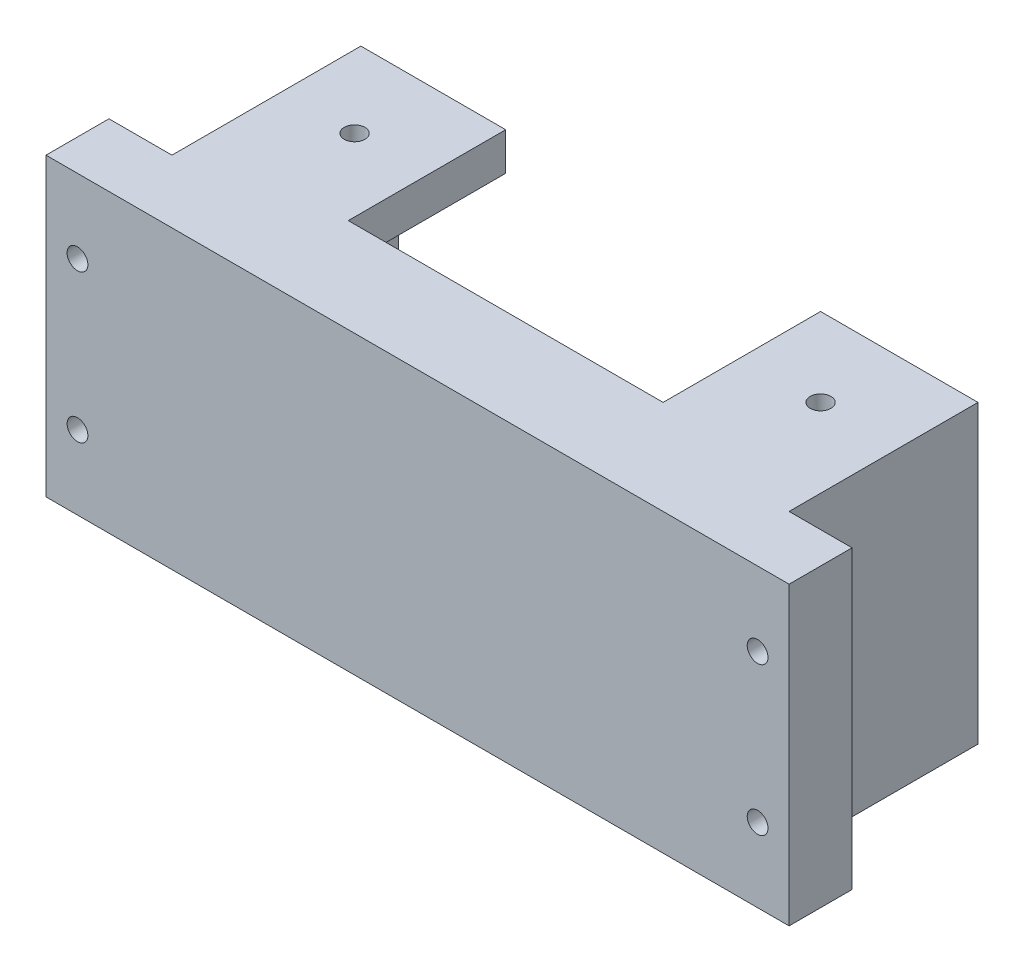
ISO-10303-21;
HEADER;
FILE_DESCRIPTION(('STEP AP214'),'2;1');
FILE_NAME('part.step','',(''),(''),'','','');
FILE_SCHEMA(('AUTOMOTIVE_DESIGN { 1 0 10303 214 1 1 1 1 }'));
ENDSEC;
DATA;
#1=APPLICATION_CONTEXT('core data for automotive mechanical design processes');
#2=APPLICATION_PROTOCOL_DEFINITION('international standard','automotive_design',2000,#1);
#3=PRODUCT_CONTEXT('',#1,'mechanical');
#4=PRODUCT('Part','Part','',(#3));
#5=PRODUCT_RELATED_PRODUCT_CATEGORY('part','',(#4));
#6=PRODUCT_DEFINITION_FORMATION('','',#4);
#7=PRODUCT_DEFINITION_CONTEXT('part definition',#1,'design');
#8=PRODUCT_DEFINITION('design','',#6,#7);
#9=PRODUCT_DEFINITION_SHAPE('','',#8);
#10=(LENGTH_UNIT() NAMED_UNIT(*) SI_UNIT(.MILLI.,.METRE.));
#11=(NAMED_UNIT(*) PLANE_ANGLE_UNIT() SI_UNIT($,.RADIAN.));
#12=(NAMED_UNIT(*) SI_UNIT($,.STERADIAN.) SOLID_ANGLE_UNIT());
#13=UNCERTAINTY_MEASURE_WITH_UNIT(LENGTH_MEASURE(1.E-05),#10,'distance_accuracy_value','');
#14=(GEOMETRIC_REPRESENTATION_CONTEXT(3) GLOBAL_UNCERTAINTY_ASSIGNED_CONTEXT((#13)) GLOBAL_UNIT_ASSIGNED_CONTEXT((#10,
#11,#12)) REPRESENTATION_CONTEXT('',''));
#15=CARTESIAN_POINT('',(0.,0.,0.));
#16=DIRECTION('',(0.,0.,1.));
#17=DIRECTION('',(1.,0.,0.));
#18=AXIS2_PLACEMENT_3D('',#15,#16,#17);
#19=CARTESIAN_POINT('',(0.,61.,0.));
#20=DIRECTION('',(0.,-1.,0.));
#21=DIRECTION('',(0.,0.,-1.));
#22=AXIS2_PLACEMENT_3D('',#19,#20,#21);
#23=PLANE('',#22);
#24=CARTESIAN_POINT('',(5.5,61.,-72.5));
#25=DIRECTION('',(0.,1.,0.));
#26=DIRECTION('',(0.,0.,1.));
#27=AXIS2_PLACEMENT_3D('',#24,#25,#26);
#28=CIRCLE('',#27,1.64999999999999);
#29=CARTESIAN_POINT('',(5.5,61.,-70.85));
#30=VERTEX_POINT('',#29);
#31=EDGE_CURVE('E822',#30,#30,#28,.T.);
#32=ORIENTED_EDGE('',*,*,#31,.F.);
#33=EDGE_LOOP('',(#32));
#34=FACE_BOUND('',#33,.T.);
#35=DIRECTION('',(0.,0.,1.));
#36=VECTOR('',#35,1.);
#37=CARTESIAN_POINT('',(-6.,61.,-4.));
#38=LINE('',#37,#36);
#39=CARTESIAN_POINT('',(-6.,61.,-85.));
#40=VERTEX_POINT('',#39);
#41=CARTESIAN_POINT('',(-6.,61.,-55.));
#42=VERTEX_POINT('',#41);
#43=EDGE_CURVE('E323',#40,#42,#38,.T.);
#44=ORIENTED_EDGE('',*,*,#43,.T.);
#45=DIRECTION('',(1.,0.,0.));
#46=VECTOR('',#45,1.);
#47=CARTESIAN_POINT('',(0.,61.,-55.));
#48=LINE('',#47,#46);
#49=CARTESIAN_POINT('',(-16.,61.,-55.));
#50=VERTEX_POINT('',#49);
#51=EDGE_CURVE('E60',#50,#42,#48,.T.);
#52=ORIENTED_EDGE('',*,*,#51,.F.);
#53=DIRECTION('',(0.,0.,-1.));
#54=VECTOR('',#53,1.);
#55=CARTESIAN_POINT('',(-16.,61.,0.));
#56=LINE('',#55,#54);
#57=CARTESIAN_POINT('',(-16.,61.,-45.));
#58=VERTEX_POINT('',#57);
#59=EDGE_CURVE('E288',#58,#50,#56,.T.);
#60=ORIENTED_EDGE('',*,*,#59,.F.);
#61=DIRECTION('',(1.,0.,0.));
#62=VECTOR('',#61,1.);
#63=CARTESIAN_POINT('',(0.,61.,-45.));
#64=LINE('',#63,#62);
#65=CARTESIAN_POINT('',(102.,61.,-45.));
#66=VERTEX_POINT('',#65);
#67=EDGE_CURVE('E11',#58,#66,#64,.T.);
#68=ORIENTED_EDGE('',*,*,#67,.T.);
#69=DIRECTION('',(0.,0.,-1.));
#70=VECTOR('',#69,1.);
#71=CARTESIAN_POINT('',(102.,61.,0.));
#72=LINE('',#71,#70);
#73=CARTESIAN_POINT('',(102.,61.,-55.));
#74=VERTEX_POINT('',#73);
#75=EDGE_CURVE('E270',#66,#74,#72,.T.);
#76=ORIENTED_EDGE('',*,*,#75,.T.);
#77=DIRECTION('',(-1.,0.,0.));
#78=VECTOR('',#77,1.);
#79=CARTESIAN_POINT('',(0.,61.,-55.));
#80=LINE('',#79,#78);
#81=CARTESIAN_POINT('',(92.,61.,-55.));
#82=VERTEX_POINT('',#81);
#83=EDGE_CURVE('E184',#74,#82,#80,.T.);
#84=ORIENTED_EDGE('',*,*,#83,.T.);
#85=DIRECTION('',(0.,0.,-1.));
#86=VECTOR('',#85,1.);
#87=CARTESIAN_POINT('',(92.,61.,-75.));
#88=LINE('',#87,#86);
#89=CARTESIAN_POINT('',(92.,61.,-85.));
#90=VERTEX_POINT('',#89);
#91=EDGE_CURVE('E175',#82,#90,#88,.T.);
#92=ORIENTED_EDGE('',*,*,#91,.T.);
#93=DIRECTION('',(1.,0.,0.));
#94=VECTOR('',#93,1.);
#95=CARTESIAN_POINT('',(92.,61.,-85.));
#96=LINE('',#95,#94);
#97=CARTESIAN_POINT('',(67.,61.,-85.));
#98=VERTEX_POINT('',#97);
#99=EDGE_CURVE('E181',#98,#90,#96,.T.);
#100=ORIENTED_EDGE('',*,*,#99,.F.);
#101=DIRECTION('',(0.,0.,1.));
#102=VECTOR('',#101,1.);
#103=CARTESIAN_POINT('',(67.,61.,-50.));
#104=LINE('',#103,#102);
#105=CARTESIAN_POINT('',(67.,61.,-60.));
#106=VERTEX_POINT('',#105);
#107=EDGE_CURVE('E185',#98,#106,#104,.T.);
#108=ORIENTED_EDGE('',*,*,#107,.T.);
#109=DIRECTION('',(-1.,0.,0.));
#110=VECTOR('',#109,1.);
#111=CARTESIAN_POINT('',(17.,61.,-60.));
#112=LINE('',#111,#110);
#113=CARTESIAN_POINT('',(17.,61.,-60.));
#114=VERTEX_POINT('',#113);
#115=EDGE_CURVE('E301',#106,#114,#112,.T.);
#116=ORIENTED_EDGE('',*,*,#115,.T.);
#117=DIRECTION('',(0.,0.,-1.));
#118=VECTOR('',#117,1.);
#119=CARTESIAN_POINT('',(17.,61.,-75.));
#120=LINE('',#119,#118);
#121=CARTESIAN_POINT('',(17.,61.,-85.));
#122=VERTEX_POINT('',#121);
#123=EDGE_CURVE('E321',#114,#122,#120,.T.);
#124=ORIENTED_EDGE('',*,*,#123,.T.);
#125=DIRECTION('',(1.,0.,0.));
#126=VECTOR('',#125,1.);
#127=CARTESIAN_POINT('',(17.,61.,-85.));
#128=LINE('',#127,#126);
#129=EDGE_CURVE('E228',#40,#122,#128,.T.);
#130=ORIENTED_EDGE('',*,*,#129,.F.);
#131=EDGE_LOOP('',(#44,#52,#60,#68,#76,#84,#92,#100,#108,#116,#124,#130));
#132=FACE_BOUND('',#131,.T.);
#133=CARTESIAN_POINT('',(79.5,61.,-72.5));
#134=DIRECTION('',(0.,1.,0.));
#135=DIRECTION('',(0.,0.,1.));
#136=AXIS2_PLACEMENT_3D('',#133,#134,#135);
#137=CIRCLE('',#136,1.64999999999998);
#138=CARTESIAN_POINT('',(79.5,61.,-70.85));
#139=VERTEX_POINT('',#138);
#140=EDGE_CURVE('E814',#139,#139,#137,.T.);
#141=ORIENTED_EDGE('',*,*,#140,.F.);
#142=EDGE_LOOP('',(#141));
#143=FACE_BOUND('',#142,.T.);
#144=ADVANCED_FACE('F37',(#34,#132,#143),#23,.F.);
#145=CARTESIAN_POINT('',(0.,14.,0.));
#146=DIRECTION('',(0.,-1.,0.));
#147=DIRECTION('',(0.,0.,-1.));
#148=AXIS2_PLACEMENT_3D('',#145,#146,#147);
#149=PLANE('',#148);
#150=CARTESIAN_POINT('',(79.5,14.,-72.5));
#151=DIRECTION('',(0.,1.,0.));
#152=DIRECTION('',(0.,0.,1.));
#153=AXIS2_PLACEMENT_3D('',#150,#151,#152);
#154=CIRCLE('',#153,1.65);
#155=CARTESIAN_POINT('',(79.5,14.,-70.85));
#156=VERTEX_POINT('',#155);
#157=EDGE_CURVE('E812',#156,#156,#154,.T.);
#158=ORIENTED_EDGE('',*,*,#157,.T.);
#159=EDGE_LOOP('',(#158));
#160=FACE_BOUND('',#159,.T.);
#161=DIRECTION('',(1.,0.,0.));
#162=VECTOR('',#161,1.);
#163=CARTESIAN_POINT('',(-26.,14.,-45.));
#164=LINE('',#163,#162);
#165=CARTESIAN_POINT('',(-16.,14.,-45.));
#166=VERTEX_POINT('',#165);
#167=CARTESIAN_POINT('',(102.,14.,-45.));
#168=VERTEX_POINT('',#167);
#169=EDGE_CURVE('E295',#166,#168,#164,.T.);
#170=ORIENTED_EDGE('',*,*,#169,.F.);
#171=DIRECTION('',(0.,0.,-1.));
#172=VECTOR('',#171,1.);
#173=CARTESIAN_POINT('',(-16.,14.,0.));
#174=LINE('',#173,#172);
#175=CARTESIAN_POINT('',(-16.,14.,-55.));
#176=VERTEX_POINT('',#175);
#177=EDGE_CURVE('E287',#166,#176,#174,.T.);
#178=ORIENTED_EDGE('',*,*,#177,.T.);
#179=DIRECTION('',(1.,0.,0.));
#180=VECTOR('',#179,1.);
#181=CARTESIAN_POINT('',(0.,14.,-55.));
#182=LINE('',#181,#180);
#183=CARTESIAN_POINT('',(-6.,14.,-55.));
#184=VERTEX_POINT('',#183);
#185=EDGE_CURVE('E285',#176,#184,#182,.T.);
#186=ORIENTED_EDGE('',*,*,#185,.T.);
#187=DIRECTION('',(0.,0.,-1.));
#188=VECTOR('',#187,1.);
#189=CARTESIAN_POINT('',(-6.,14.,-4.));
#190=LINE('',#189,#188);
#191=CARTESIAN_POINT('',(-6.,14.,-85.));
#192=VERTEX_POINT('',#191);
#193=EDGE_CURVE('E325',#184,#192,#190,.T.);
#194=ORIENTED_EDGE('',*,*,#193,.T.);
#195=DIRECTION('',(-1.,0.,0.));
#196=VECTOR('',#195,1.);
#197=CARTESIAN_POINT('',(-6.,14.,-85.));
#198=LINE('',#197,#196);
#199=CARTESIAN_POINT('',(17.,14.,-85.));
#200=VERTEX_POINT('',#199);
#201=EDGE_CURVE('E222',#200,#192,#198,.T.);
#202=ORIENTED_EDGE('',*,*,#201,.F.);
#203=DIRECTION('',(0.,0.,1.));
#204=VECTOR('',#203,1.);
#205=CARTESIAN_POINT('',(17.,14.,-75.));
#206=LINE('',#205,#204);
#207=CARTESIAN_POINT('',(17.,14.,-60.));
#208=VERTEX_POINT('',#207);
#209=EDGE_CURVE('E327',#200,#208,#206,.T.);
#210=ORIENTED_EDGE('',*,*,#209,.T.);
#211=DIRECTION('',(-1.,0.,0.));
#212=VECTOR('',#211,1.);
#213=CARTESIAN_POINT('',(0.,14.,-60.));
#214=LINE('',#213,#212);
#215=CARTESIAN_POINT('',(67.,14.,-60.));
#216=VERTEX_POINT('',#215);
#217=EDGE_CURVE('E309',#216,#208,#214,.T.);
#218=ORIENTED_EDGE('',*,*,#217,.F.);
#219=DIRECTION('',(0.,0.,-1.));
#220=VECTOR('',#219,1.);
#221=CARTESIAN_POINT('',(67.,14.,-50.));
#222=LINE('',#221,#220);
#223=CARTESIAN_POINT('',(67.,14.,-85.));
#224=VERTEX_POINT('',#223);
#225=EDGE_CURVE('E330',#216,#224,#222,.T.);
#226=ORIENTED_EDGE('',*,*,#225,.T.);
#227=DIRECTION('',(-1.,0.,0.));
#228=VECTOR('',#227,1.);
#229=CARTESIAN_POINT('',(67.,14.,-85.));
#230=LINE('',#229,#228);
#231=CARTESIAN_POINT('',(92.,14.,-85.));
#232=VERTEX_POINT('',#231);
#233=EDGE_CURVE('E195',#232,#224,#230,.T.);
#234=ORIENTED_EDGE('',*,*,#233,.F.);
#235=DIRECTION('',(0.,0.,1.));
#236=VECTOR('',#235,1.);
#237=CARTESIAN_POINT('',(92.,14.,-75.));
#238=LINE('',#237,#236);
#239=CARTESIAN_POINT('',(92.,14.,-55.));
#240=VERTEX_POINT('',#239);
#241=EDGE_CURVE('E191',#232,#240,#238,.T.);
#242=ORIENTED_EDGE('',*,*,#241,.T.);
#243=DIRECTION('',(-1.,0.,0.));
#244=VECTOR('',#243,1.);
#245=CARTESIAN_POINT('',(0.,14.,-55.));
#246=LINE('',#245,#244);
#247=CARTESIAN_POINT('',(102.,14.,-55.));
#248=VERTEX_POINT('',#247);
#249=EDGE_CURVE('E274',#248,#240,#246,.T.);
#250=ORIENTED_EDGE('',*,*,#249,.F.);
#251=DIRECTION('',(0.,0.,-1.));
#252=VECTOR('',#251,1.);
#253=CARTESIAN_POINT('',(102.,14.,0.));
#254=LINE('',#253,#252);
#255=EDGE_CURVE('E271',#168,#248,#254,.T.);
#256=ORIENTED_EDGE('',*,*,#255,.F.);
#257=EDGE_LOOP('',(#170,#178,#186,#194,#202,#210,#218,#226,#234,#242,#250,#256));
#258=FACE_BOUND('',#257,.T.);
#259=CARTESIAN_POINT('',(5.5,14.,-72.5));
#260=DIRECTION('',(0.,1.,0.));
#261=DIRECTION('',(0.,0.,1.));
#262=AXIS2_PLACEMENT_3D('',#259,#260,#261);
#263=CIRCLE('',#262,1.64999999999999);
#264=CARTESIAN_POINT('',(5.5,14.,-70.85));
#265=VERTEX_POINT('',#264);
#266=EDGE_CURVE('E825',#265,#265,#263,.T.);
#267=ORIENTED_EDGE('',*,*,#266,.T.);
#268=EDGE_LOOP('',(#267));
#269=FACE_BOUND('',#268,.T.);
#270=ADVANCED_FACE('F372',(#160,#258,#269),#149,.T.);
#271=CARTESIAN_POINT('',(92.,75.,0.));
#272=DIRECTION('',(-1.,0.,0.));
#273=DIRECTION('',(0.,0.,1.));
#274=AXIS2_PLACEMENT_3D('',#271,#272,#273);
#275=PLANE('',#274);
#276=DIRECTION('',(0.,1.,0.));
#277=VECTOR('',#276,1.);
#278=CARTESIAN_POINT('',(92.,14.,-55.));
#279=LINE('',#278,#277);
#280=EDGE_CURVE('E52',#240,#82,#279,.T.);
#281=ORIENTED_EDGE('',*,*,#280,.F.);
#282=ORIENTED_EDGE('',*,*,#241,.F.);
#283=DIRECTION('',(0.,-1.,0.));
#284=VECTOR('',#283,1.);
#285=CARTESIAN_POINT('',(92.,14.,-85.));
#286=LINE('',#285,#284);
#287=EDGE_CURVE('E189',#90,#232,#286,.T.);
#288=ORIENTED_EDGE('',*,*,#287,.F.);
#289=ORIENTED_EDGE('',*,*,#91,.F.);
#290=EDGE_LOOP('',(#281,#282,#288,#289));
#291=FACE_BOUND('',#290,.T.);
#292=ADVANCED_FACE('F190',(#291),#275,.F.);
#293=CARTESIAN_POINT('',(67.,75.,0.));
#294=DIRECTION('',(1.,0.,0.));
#295=DIRECTION('',(0.,0.,-1.));
#296=AXIS2_PLACEMENT_3D('',#293,#294,#295);
#297=PLANE('',#296);
#298=DIRECTION('',(0.,-1.,0.));
#299=VECTOR('',#298,1.);
#300=CARTESIAN_POINT('',(67.,20.,-60.));
#301=LINE('',#300,#299);
#302=CARTESIAN_POINT('',(67.,20.,-60.));
#303=VERTEX_POINT('',#302);
#304=EDGE_CURVE('E314',#303,#216,#301,.T.);
#305=ORIENTED_EDGE('',*,*,#304,.F.);
#306=DIRECTION('',(0.,0.,1.));
#307=VECTOR('',#306,1.);
#308=CARTESIAN_POINT('',(67.,20.,0.));
#309=LINE('',#308,#307);
#310=CARTESIAN_POINT('',(67.,20.,-85.));
#311=VERTEX_POINT('',#310);
#312=EDGE_CURVE('E354',#311,#303,#309,.T.);
#313=ORIENTED_EDGE('',*,*,#312,.F.);
#314=DIRECTION('',(0.,1.,0.));
#315=VECTOR('',#314,1.);
#316=CARTESIAN_POINT('',(67.,20.,-85.));
#317=LINE('',#316,#315);
#318=EDGE_CURVE('E210',#224,#311,#317,.T.);
#319=ORIENTED_EDGE('',*,*,#318,.F.);
#320=ORIENTED_EDGE('',*,*,#225,.F.);
#321=EDGE_LOOP('',(#305,#313,#319,#320));
#322=FACE_BOUND('',#321,.T.);
#323=ADVANCED_FACE('F442',(#322),#297,.F.);
#324=CARTESIAN_POINT('',(17.,75.,0.));
#325=DIRECTION('',(-1.,0.,0.));
#326=DIRECTION('',(0.,0.,1.));
#327=AXIS2_PLACEMENT_3D('',#324,#325,#326);
#328=PLANE('',#327);
#329=DIRECTION('',(0.,-1.,0.));
#330=VECTOR('',#329,1.);
#331=CARTESIAN_POINT('',(17.,20.,-60.));
#332=LINE('',#331,#330);
#333=CARTESIAN_POINT('',(17.,20.,-60.));
#334=VERTEX_POINT('',#333);
#335=EDGE_CURVE('E186',#334,#208,#332,.T.);
#336=ORIENTED_EDGE('',*,*,#335,.T.);
#337=ORIENTED_EDGE('',*,*,#209,.F.);
#338=DIRECTION('',(0.,-1.,0.));
#339=VECTOR('',#338,1.);
#340=CARTESIAN_POINT('',(17.,14.,-85.));
#341=LINE('',#340,#339);
#342=CARTESIAN_POINT('',(17.,20.,-85.));
#343=VERTEX_POINT('',#342);
#344=EDGE_CURVE('E243',#343,#200,#341,.T.);
#345=ORIENTED_EDGE('',*,*,#344,.F.);
#346=DIRECTION('',(0.,0.,-1.));
#347=VECTOR('',#346,1.);
#348=CARTESIAN_POINT('',(17.,20.,0.));
#349=LINE('',#348,#347);
#350=EDGE_CURVE('E45',#334,#343,#349,.T.);
#351=ORIENTED_EDGE('',*,*,#350,.F.);
#352=EDGE_LOOP('',(#336,#337,#345,#351));
#353=FACE_BOUND('',#352,.T.);
#354=ADVANCED_FACE('F370',(#353),#328,.F.);
#355=CARTESIAN_POINT('',(0.,75.,-50.));
#356=DIRECTION('',(0.,0.,1.));
#357=DIRECTION('',(1.,0.,0.));
#358=AXIS2_PLACEMENT_3D('',#355,#356,#357);
#359=PLANE('',#358);
#360=DIRECTION('',(0.,1.,0.));
#361=VECTOR('',#360,1.);
#362=CARTESIAN_POINT('',(0.,0.,-50.));
#363=LINE('',#362,#361);
#364=CARTESIAN_POINT('',(0.,20.,-50.));
#365=VERTEX_POINT('',#364);
#366=CARTESIAN_POINT('',(0.,55.,-50.));
#367=VERTEX_POINT('',#366);
#368=EDGE_CURVE('E335',#365,#367,#363,.T.);
#369=ORIENTED_EDGE('',*,*,#368,.T.);
#370=DIRECTION('',(1.,0.,0.));
#371=VECTOR('',#370,1.);
#372=CARTESIAN_POINT('',(0.,55.,-50.));
#373=LINE('',#372,#371);
#374=CARTESIAN_POINT('',(86.,55.,-50.));
#375=VERTEX_POINT('',#374);
#376=EDGE_CURVE('E338',#367,#375,#373,.T.);
#377=ORIENTED_EDGE('',*,*,#376,.T.);
#378=DIRECTION('',(0.,1.,0.));
#379=VECTOR('',#378,1.);
#380=CARTESIAN_POINT('',(86.,0.,-50.));
#381=LINE('',#380,#379);
#382=CARTESIAN_POINT('',(86.,20.,-50.));
#383=VERTEX_POINT('',#382);
#384=EDGE_CURVE('E340',#383,#375,#381,.T.);
#385=ORIENTED_EDGE('',*,*,#384,.F.);
#386=DIRECTION('',(1.,0.,0.));
#387=VECTOR('',#386,1.);
#388=CARTESIAN_POINT('',(0.,20.,-50.));
#389=LINE('',#388,#387);
#390=EDGE_CURVE('E333',#365,#383,#389,.T.);
#391=ORIENTED_EDGE('',*,*,#390,.F.);
#392=EDGE_LOOP('',(#369,#377,#385,#391));
#393=FACE_BOUND('',#392,.T.);
#394=ADVANCED_FACE('F394',(#393),#359,.F.);
#395=CARTESIAN_POINT('',(-6.,75.,0.));
#396=DIRECTION('',(1.,0.,0.));
#397=DIRECTION('',(0.,0.,-1.));
#398=AXIS2_PLACEMENT_3D('',#395,#396,#397);
#399=PLANE('',#398);
#400=ORIENTED_EDGE('',*,*,#193,.F.);
#401=DIRECTION('',(0.,1.,0.));
#402=VECTOR('',#401,1.);
#403=CARTESIAN_POINT('',(-6.,14.,-55.));
#404=LINE('',#403,#402);
#405=EDGE_CURVE('E293',#184,#42,#404,.T.);
#406=ORIENTED_EDGE('',*,*,#405,.T.);
#407=ORIENTED_EDGE('',*,*,#43,.F.);
#408=DIRECTION('',(0.,1.,0.));
#409=VECTOR('',#408,1.);
#410=CARTESIAN_POINT('',(-6.,61.,-85.));
#411=LINE('',#410,#409);
#412=EDGE_CURVE('E225',#192,#40,#411,.T.);
#413=ORIENTED_EDGE('',*,*,#412,.F.);
#414=EDGE_LOOP('',(#400,#406,#407,#413));
#415=FACE_BOUND('',#414,.T.);
#416=ADVANCED_FACE('F39',(#415),#399,.F.);
#417=DIRECTION('',(0.,0.,1.));
#418=VECTOR('',#417,1.);
#419=CARTESIAN_POINT('',(67.,55.,0.));
#420=LINE('',#419,#418);
#421=CARTESIAN_POINT('',(67.,55.,-85.));
#422=VERTEX_POINT('',#421);
#423=CARTESIAN_POINT('',(67.,55.,-60.));
#424=VERTEX_POINT('',#423);
#425=EDGE_CURVE('E346',#422,#424,#420,.T.);
#426=ORIENTED_EDGE('',*,*,#425,.T.);
#427=DIRECTION('',(0.,1.,0.));
#428=VECTOR('',#427,1.);
#429=CARTESIAN_POINT('',(67.,55.,-60.));
#430=LINE('',#429,#428);
#431=EDGE_CURVE('E304',#424,#106,#430,.T.);
#432=ORIENTED_EDGE('',*,*,#431,.T.);
#433=ORIENTED_EDGE('',*,*,#107,.F.);
#434=DIRECTION('',(0.,1.,0.));
#435=VECTOR('',#434,1.);
#436=CARTESIAN_POINT('',(67.,61.,-85.));
#437=LINE('',#436,#435);
#438=EDGE_CURVE('E201',#422,#98,#437,.T.);
#439=ORIENTED_EDGE('',*,*,#438,.F.);
#440=EDGE_LOOP('',(#426,#432,#433,#439));
#441=FACE_BOUND('',#440,.T.);
#442=ADVANCED_FACE('F404',(#441),#297,.F.);
#443=ORIENTED_EDGE('',*,*,#123,.F.);
#444=DIRECTION('',(0.,1.,0.));
#445=VECTOR('',#444,1.);
#446=CARTESIAN_POINT('',(17.,55.,-60.));
#447=LINE('',#446,#445);
#448=CARTESIAN_POINT('',(17.,55.,-60.));
#449=VERTEX_POINT('',#448);
#450=EDGE_CURVE('E307',#449,#114,#447,.T.);
#451=ORIENTED_EDGE('',*,*,#450,.F.);
#452=DIRECTION('',(0.,0.,-1.));
#453=VECTOR('',#452,1.);
#454=CARTESIAN_POINT('',(17.,55.,0.));
#455=LINE('',#454,#453);
#456=CARTESIAN_POINT('',(17.,55.,-85.));
#457=VERTEX_POINT('',#456);
#458=EDGE_CURVE('E357',#449,#457,#455,.T.);
#459=ORIENTED_EDGE('',*,*,#458,.T.);
#460=DIRECTION('',(0.,-1.,0.));
#461=VECTOR('',#460,1.);
#462=CARTESIAN_POINT('',(17.,55.,-85.));
#463=LINE('',#462,#461);
#464=EDGE_CURVE('E231',#122,#457,#463,.T.);
#465=ORIENTED_EDGE('',*,*,#464,.F.);
#466=EDGE_LOOP('',(#443,#451,#459,#465));
#467=FACE_BOUND('',#466,.T.);
#468=ADVANCED_FACE('F382',(#467),#328,.F.);
#469=CARTESIAN_POINT('',(0.,0.,-50.));
#470=DIRECTION('',(-1.,0.,0.));
#471=DIRECTION('',(0.,-1.,0.));
#472=AXIS2_PLACEMENT_3D('',#469,#470,#471);
#473=PLANE('',#472);
#474=DIRECTION('',(0.,0.,-1.));
#475=VECTOR('',#474,1.);
#476=CARTESIAN_POINT('',(0.,20.,-50.));
#477=LINE('',#476,#475);
#478=CARTESIAN_POINT('',(0.,20.,-85.));
#479=VERTEX_POINT('',#478);
#480=EDGE_CURVE('E343',#365,#479,#477,.T.);
#481=ORIENTED_EDGE('',*,*,#480,.T.);
#482=DIRECTION('',(0.,-1.,0.));
#483=VECTOR('',#482,1.);
#484=CARTESIAN_POINT('',(0.,20.,-85.));
#485=LINE('',#484,#483);
#486=CARTESIAN_POINT('',(0.,55.,-85.));
#487=VERTEX_POINT('',#486);
#488=EDGE_CURVE('E237',#487,#479,#485,.T.);
#489=ORIENTED_EDGE('',*,*,#488,.F.);
#490=DIRECTION('',(0.,0.,-1.));
#491=VECTOR('',#490,1.);
#492=CARTESIAN_POINT('',(0.,55.,-50.));
#493=LINE('',#492,#491);
#494=EDGE_CURVE('E349',#367,#487,#493,.T.);
#495=ORIENTED_EDGE('',*,*,#494,.F.);
#496=ORIENTED_EDGE('',*,*,#368,.F.);
#497=EDGE_LOOP('',(#481,#489,#495,#496));
#498=FACE_BOUND('',#497,.T.);
#499=ADVANCED_FACE('F392',(#498),#473,.F.);
#500=CARTESIAN_POINT('',(0.,20.,-50.));
#501=DIRECTION('',(0.,1.,0.));
#502=DIRECTION('',(0.,0.,1.));
#503=AXIS2_PLACEMENT_3D('',#500,#501,#502);
#504=PLANE('',#503);
#505=CARTESIAN_POINT('',(79.5,20.,-72.5));
#506=DIRECTION('',(0.,1.,0.));
#507=DIRECTION('',(0.,0.,1.));
#508=AXIS2_PLACEMENT_3D('',#505,#506,#507);
#509=CIRCLE('',#508,1.64999999999999);
#510=CARTESIAN_POINT('',(79.5,20.,-70.85));
#511=VERTEX_POINT('',#510);
#512=EDGE_CURVE('E809',#511,#511,#509,.T.);
#513=ORIENTED_EDGE('',*,*,#512,.F.);
#514=EDGE_LOOP('',(#513));
#515=FACE_BOUND('',#514,.T.);
#516=CARTESIAN_POINT('',(5.5,20.,-72.5));
#517=DIRECTION('',(0.,1.,0.));
#518=DIRECTION('',(0.,0.,1.));
#519=AXIS2_PLACEMENT_3D('',#516,#517,#518);
#520=CIRCLE('',#519,1.64999999999999);
#521=CARTESIAN_POINT('',(5.5,20.,-70.85));
#522=VERTEX_POINT('',#521);
#523=EDGE_CURVE('E205',#522,#522,#520,.T.);
#524=ORIENTED_EDGE('',*,*,#523,.F.);
#525=EDGE_LOOP('',(#524));
#526=FACE_BOUND('',#525,.T.);
#527=ORIENTED_EDGE('',*,*,#312,.T.);
#528=DIRECTION('',(-1.,0.,0.));
#529=VECTOR('',#528,1.);
#530=CARTESIAN_POINT('',(0.,20.,-60.));
#531=LINE('',#530,#529);
#532=EDGE_CURVE('E312',#303,#334,#531,.T.);
#533=ORIENTED_EDGE('',*,*,#532,.T.);
#534=ORIENTED_EDGE('',*,*,#350,.T.);
#535=DIRECTION('',(1.,0.,0.));
#536=VECTOR('',#535,1.);
#537=CARTESIAN_POINT('',(17.,20.,-85.));
#538=LINE('',#537,#536);
#539=EDGE_CURVE('E240',#479,#343,#538,.T.);
#540=ORIENTED_EDGE('',*,*,#539,.F.);
#541=ORIENTED_EDGE('',*,*,#480,.F.);
#542=ORIENTED_EDGE('',*,*,#390,.T.);
#543=DIRECTION('',(0.,0.,-1.));
#544=VECTOR('',#543,1.);
#545=CARTESIAN_POINT('',(86.,20.,-50.));
#546=LINE('',#545,#544);
#547=CARTESIAN_POINT('',(86.,20.,-85.));
#548=VERTEX_POINT('',#547);
#549=EDGE_CURVE('E344',#383,#548,#546,.T.);
#550=ORIENTED_EDGE('',*,*,#549,.T.);
#551=DIRECTION('',(1.,0.,0.));
#552=VECTOR('',#551,1.);
#553=CARTESIAN_POINT('',(86.,20.,-85.));
#554=LINE('',#553,#552);
#555=EDGE_CURVE('E213',#311,#548,#554,.T.);
#556=ORIENTED_EDGE('',*,*,#555,.F.);
#557=EDGE_LOOP('',(#527,#533,#534,#540,#541,#542,#550,#556));
#558=FACE_BOUND('',#557,.T.);
#559=ADVANCED_FACE('F361',(#515,#526,#558),#504,.T.);
#560=CARTESIAN_POINT('',(0.,55.,-50.));
#561=DIRECTION('',(0.,1.,0.));
#562=DIRECTION('',(0.,0.,1.));
#563=AXIS2_PLACEMENT_3D('',#560,#561,#562);
#564=PLANE('',#563);
#565=CARTESIAN_POINT('',(79.5,55.,-72.5));
#566=DIRECTION('',(0.,1.,0.));
#567=DIRECTION('',(0.,0.,1.));
#568=AXIS2_PLACEMENT_3D('',#565,#566,#567);
#569=CIRCLE('',#568,1.64999999999999);
#570=CARTESIAN_POINT('',(79.5,55.,-70.85));
#571=VERTEX_POINT('',#570);
#572=EDGE_CURVE('E813',#571,#571,#569,.T.);
#573=ORIENTED_EDGE('',*,*,#572,.T.);
#574=EDGE_LOOP('',(#573));
#575=FACE_BOUND('',#574,.T.);
#576=CARTESIAN_POINT('',(5.5,55.,-72.5));
#577=DIRECTION('',(0.,1.,0.));
#578=DIRECTION('',(0.,0.,1.));
#579=AXIS2_PLACEMENT_3D('',#576,#577,#578);
#580=CIRCLE('',#579,1.64999999999999);
#581=CARTESIAN_POINT('',(5.5,55.,-70.85));
#582=VERTEX_POINT('',#581);
#583=EDGE_CURVE('E202',#582,#582,#580,.T.);
#584=ORIENTED_EDGE('',*,*,#583,.T.);
#585=EDGE_LOOP('',(#584));
#586=FACE_BOUND('',#585,.T.);
#587=ORIENTED_EDGE('',*,*,#425,.F.);
#588=DIRECTION('',(-1.,0.,0.));
#589=VECTOR('',#588,1.);
#590=CARTESIAN_POINT('',(67.,55.,-85.));
#591=LINE('',#590,#589);
#592=CARTESIAN_POINT('',(86.,55.,-85.));
#593=VERTEX_POINT('',#592);
#594=EDGE_CURVE('E219',#593,#422,#591,.T.);
#595=ORIENTED_EDGE('',*,*,#594,.F.);
#596=DIRECTION('',(0.,0.,-1.));
#597=VECTOR('',#596,1.);
#598=CARTESIAN_POINT('',(86.,55.,-50.));
#599=LINE('',#598,#597);
#600=EDGE_CURVE('E347',#375,#593,#599,.T.);
#601=ORIENTED_EDGE('',*,*,#600,.F.);
#602=ORIENTED_EDGE('',*,*,#376,.F.);
#603=ORIENTED_EDGE('',*,*,#494,.T.);
#604=DIRECTION('',(-1.,0.,0.));
#605=VECTOR('',#604,1.);
#606=CARTESIAN_POINT('',(0.,55.,-85.));
#607=LINE('',#606,#605);
#608=EDGE_CURVE('E234',#457,#487,#607,.T.);
#609=ORIENTED_EDGE('',*,*,#608,.F.);
#610=ORIENTED_EDGE('',*,*,#458,.F.);
#611=DIRECTION('',(-1.,0.,0.));
#612=VECTOR('',#611,1.);
#613=CARTESIAN_POINT('',(17.,55.,-60.));
#614=LINE('',#613,#612);
#615=EDGE_CURVE('E302',#424,#449,#614,.T.);
#616=ORIENTED_EDGE('',*,*,#615,.F.);
#617=EDGE_LOOP('',(#587,#595,#601,#602,#603,#609,#610,#616));
#618=FACE_BOUND('',#617,.T.);
#619=ADVANCED_FACE('F386',(#575,#586,#618),#564,.F.);
#620=CARTESIAN_POINT('',(86.,0.,-50.));
#621=DIRECTION('',(-1.,0.,0.));
#622=DIRECTION('',(0.,0.,1.));
#623=AXIS2_PLACEMENT_3D('',#620,#621,#622);
#624=PLANE('',#623);
#625=ORIENTED_EDGE('',*,*,#600,.T.);
#626=DIRECTION('',(0.,1.,0.));
#627=VECTOR('',#626,1.);
#628=CARTESIAN_POINT('',(86.,55.,-85.));
#629=LINE('',#628,#627);
#630=EDGE_CURVE('E216',#548,#593,#629,.T.);
#631=ORIENTED_EDGE('',*,*,#630,.F.);
#632=ORIENTED_EDGE('',*,*,#549,.F.);
#633=ORIENTED_EDGE('',*,*,#384,.T.);
#634=EDGE_LOOP('',(#625,#631,#632,#633));
#635=FACE_BOUND('',#634,.T.);
#636=ADVANCED_FACE('F402',(#635),#624,.T.);
#637=CARTESIAN_POINT('',(0.,20.,-60.));
#638=DIRECTION('',(0.,0.,1.));
#639=DIRECTION('',(1.,0.,0.));
#640=AXIS2_PLACEMENT_3D('',#637,#638,#639);
#641=PLANE('',#640);
#642=ORIENTED_EDGE('',*,*,#217,.T.);
#643=ORIENTED_EDGE('',*,*,#335,.F.);
#644=ORIENTED_EDGE('',*,*,#532,.F.);
#645=ORIENTED_EDGE('',*,*,#304,.T.);
#646=EDGE_LOOP('',(#642,#643,#644,#645));
#647=FACE_BOUND('',#646,.T.);
#648=ADVANCED_FACE('F409',(#647),#641,.F.);
#649=CARTESIAN_POINT('',(17.,55.,-60.));
#650=DIRECTION('',(0.,0.,-1.));
#651=DIRECTION('',(-1.,0.,0.));
#652=AXIS2_PLACEMENT_3D('',#649,#650,#651);
#653=PLANE('',#652);
#654=ORIENTED_EDGE('',*,*,#115,.F.);
#655=ORIENTED_EDGE('',*,*,#431,.F.);
#656=ORIENTED_EDGE('',*,*,#615,.T.);
#657=ORIENTED_EDGE('',*,*,#450,.T.);
#658=EDGE_LOOP('',(#654,#655,#656,#657));
#659=FACE_BOUND('',#658,.T.);
#660=ADVANCED_FACE('F406',(#659),#653,.T.);
#661=CARTESIAN_POINT('',(112.,14.,-45.));
#662=DIRECTION('',(0.,0.,-1.));
#663=DIRECTION('',(-1.,0.,0.));
#664=AXIS2_PLACEMENT_3D('',#661,#662,#663);
#665=PLANE('',#664);
#666=CARTESIAN_POINT('',(97.,25.75,-45.));
#667=DIRECTION('',(0.,0.,-1.));
#668=DIRECTION('',(-1.,0.,0.));
#669=AXIS2_PLACEMENT_3D('',#666,#667,#668);
#670=CIRCLE('',#669,1.65);
#671=CARTESIAN_POINT('',(95.35,25.75,-45.));
#672=VERTEX_POINT('',#671);
#673=EDGE_CURVE('E249',#672,#672,#670,.T.);
#674=ORIENTED_EDGE('',*,*,#673,.T.);
#675=EDGE_LOOP('',(#674));
#676=FACE_BOUND('',#675,.T.);
#677=CARTESIAN_POINT('',(97.,49.25,-45.));
#678=DIRECTION('',(0.,0.,-1.));
#679=DIRECTION('',(-1.,0.,0.));
#680=AXIS2_PLACEMENT_3D('',#677,#678,#679);
#681=CIRCLE('',#680,1.65);
#682=CARTESIAN_POINT('',(95.35,49.25,-45.));
#683=VERTEX_POINT('',#682);
#684=EDGE_CURVE('E255',#683,#683,#681,.T.);
#685=ORIENTED_EDGE('',*,*,#684,.T.);
#686=EDGE_LOOP('',(#685));
#687=FACE_BOUND('',#686,.T.);
#688=CARTESIAN_POINT('',(-11.,49.25,-45.));
#689=DIRECTION('',(0.,0.,-1.));
#690=DIRECTION('',(-1.,0.,0.));
#691=AXIS2_PLACEMENT_3D('',#688,#689,#690);
#692=CIRCLE('',#691,1.65);
#693=CARTESIAN_POINT('',(-12.65,49.25,-45.));
#694=VERTEX_POINT('',#693);
#695=EDGE_CURVE('E261',#694,#694,#692,.T.);
#696=ORIENTED_EDGE('',*,*,#695,.T.);
#697=EDGE_LOOP('',(#696));
#698=FACE_BOUND('',#697,.T.);
#699=CARTESIAN_POINT('',(-11.,25.75,-45.));
#700=DIRECTION('',(0.,0.,-1.));
#701=DIRECTION('',(-1.,0.,0.));
#702=AXIS2_PLACEMENT_3D('',#699,#700,#701);
#703=CIRCLE('',#702,1.65);
#704=CARTESIAN_POINT('',(-12.65,25.75,-45.));
#705=VERTEX_POINT('',#704);
#706=EDGE_CURVE('E267',#705,#705,#703,.T.);
#707=ORIENTED_EDGE('',*,*,#706,.T.);
#708=EDGE_LOOP('',(#707));
#709=FACE_BOUND('',#708,.T.);
#710=ORIENTED_EDGE('',*,*,#169,.T.);
#711=DIRECTION('',(0.,1.,0.));
#712=VECTOR('',#711,1.);
#713=CARTESIAN_POINT('',(102.,14.,-45.));
#714=LINE('',#713,#712);
#715=EDGE_CURVE('E280',#168,#66,#714,.T.);
#716=ORIENTED_EDGE('',*,*,#715,.T.);
#717=ORIENTED_EDGE('',*,*,#67,.F.);
#718=DIRECTION('',(0.,1.,0.));
#719=VECTOR('',#718,1.);
#720=CARTESIAN_POINT('',(-16.,14.,-45.));
#721=LINE('',#720,#719);
#722=EDGE_CURVE('E296',#166,#58,#721,.T.);
#723=ORIENTED_EDGE('',*,*,#722,.F.);
#724=EDGE_LOOP('',(#710,#716,#717,#723));
#725=FACE_BOUND('',#724,.T.);
#726=ADVANCED_FACE('F408',(#676,#687,#698,#709,#725),#665,.F.);
#727=CARTESIAN_POINT('',(0.,14.,-55.));
#728=DIRECTION('',(0.,0.,1.));
#729=DIRECTION('',(1.,0.,0.));
#730=AXIS2_PLACEMENT_3D('',#727,#728,#729);
#731=PLANE('',#730);
#732=CARTESIAN_POINT('',(-11.,49.25,-55.));
#733=DIRECTION('',(0.,0.,-1.));
#734=DIRECTION('',(-1.,0.,0.));
#735=AXIS2_PLACEMENT_3D('',#732,#733,#734);
#736=CIRCLE('',#735,1.64999999999999);
#737=CARTESIAN_POINT('',(-12.65,49.25,-55.));
#738=VERTEX_POINT('',#737);
#739=EDGE_CURVE('E258',#738,#738,#736,.T.);
#740=ORIENTED_EDGE('',*,*,#739,.F.);
#741=EDGE_LOOP('',(#740));
#742=FACE_BOUND('',#741,.T.);
#743=CARTESIAN_POINT('',(-11.,25.75,-55.));
#744=DIRECTION('',(0.,0.,-1.));
#745=DIRECTION('',(-1.,0.,0.));
#746=AXIS2_PLACEMENT_3D('',#743,#744,#745);
#747=CIRCLE('',#746,1.64999999999999);
#748=CARTESIAN_POINT('',(-12.65,25.75,-55.));
#749=VERTEX_POINT('',#748);
#750=EDGE_CURVE('E264',#749,#749,#747,.T.);
#751=ORIENTED_EDGE('',*,*,#750,.F.);
#752=EDGE_LOOP('',(#751));
#753=FACE_BOUND('',#752,.T.);
#754=ORIENTED_EDGE('',*,*,#51,.T.);
#755=ORIENTED_EDGE('',*,*,#405,.F.);
#756=ORIENTED_EDGE('',*,*,#185,.F.);
#757=DIRECTION('',(0.,1.,0.));
#758=VECTOR('',#757,1.);
#759=CARTESIAN_POINT('',(-16.,14.,-55.));
#760=LINE('',#759,#758);
#761=EDGE_CURVE('E290',#176,#50,#760,.T.);
#762=ORIENTED_EDGE('',*,*,#761,.T.);
#763=EDGE_LOOP('',(#754,#755,#756,#762));
#764=FACE_BOUND('',#763,.T.);
#765=ADVANCED_FACE('F415',(#742,#753,#764),#731,.F.);
#766=CARTESIAN_POINT('',(-16.,14.,0.));
#767=DIRECTION('',(1.,0.,0.));
#768=DIRECTION('',(0.,0.,-1.));
#769=AXIS2_PLACEMENT_3D('',#766,#767,#768);
#770=PLANE('',#769);
#771=ORIENTED_EDGE('',*,*,#59,.T.);
#772=ORIENTED_EDGE('',*,*,#761,.F.);
#773=ORIENTED_EDGE('',*,*,#177,.F.);
#774=ORIENTED_EDGE('',*,*,#722,.T.);
#775=EDGE_LOOP('',(#771,#772,#773,#774));
#776=FACE_BOUND('',#775,.T.);
#777=ADVANCED_FACE('F470',(#776),#770,.F.);
#778=CARTESIAN_POINT('',(102.,14.,0.));
#779=DIRECTION('',(1.,0.,0.));
#780=DIRECTION('',(0.,0.,-1.));
#781=AXIS2_PLACEMENT_3D('',#778,#779,#780);
#782=PLANE('',#781);
#783=ORIENTED_EDGE('',*,*,#75,.F.);
#784=ORIENTED_EDGE('',*,*,#715,.F.);
#785=ORIENTED_EDGE('',*,*,#255,.T.);
#786=DIRECTION('',(0.,1.,0.));
#787=VECTOR('',#786,1.);
#788=CARTESIAN_POINT('',(102.,14.,-55.));
#789=LINE('',#788,#787);
#790=EDGE_CURVE('E277',#248,#74,#789,.T.);
#791=ORIENTED_EDGE('',*,*,#790,.T.);
#792=EDGE_LOOP('',(#783,#784,#785,#791));
#793=FACE_BOUND('',#792,.T.);
#794=ADVANCED_FACE('F462',(#793),#782,.T.);
#795=CARTESIAN_POINT('',(0.,14.,-55.));
#796=DIRECTION('',(0.,0.,-1.));
#797=DIRECTION('',(-1.,0.,0.));
#798=AXIS2_PLACEMENT_3D('',#795,#796,#797);
#799=PLANE('',#798);
#800=CARTESIAN_POINT('',(97.,25.75,-55.));
#801=DIRECTION('',(0.,0.,-1.));
#802=DIRECTION('',(-1.,0.,0.));
#803=AXIS2_PLACEMENT_3D('',#800,#801,#802);
#804=CIRCLE('',#803,1.64999999999998);
#805=CARTESIAN_POINT('',(95.35,25.75,-55.));
#806=VERTEX_POINT('',#805);
#807=EDGE_CURVE('E246',#806,#806,#804,.T.);
#808=ORIENTED_EDGE('',*,*,#807,.F.);
#809=EDGE_LOOP('',(#808));
#810=FACE_BOUND('',#809,.T.);
#811=CARTESIAN_POINT('',(97.,49.25,-55.));
#812=DIRECTION('',(0.,0.,-1.));
#813=DIRECTION('',(-1.,0.,0.));
#814=AXIS2_PLACEMENT_3D('',#811,#812,#813);
#815=CIRCLE('',#814,1.64999999999998);
#816=CARTESIAN_POINT('',(95.35,49.25,-55.));
#817=VERTEX_POINT('',#816);
#818=EDGE_CURVE('E252',#817,#817,#815,.T.);
#819=ORIENTED_EDGE('',*,*,#818,.F.);
#820=EDGE_LOOP('',(#819));
#821=FACE_BOUND('',#820,.T.);
#822=ORIENTED_EDGE('',*,*,#83,.F.);
#823=ORIENTED_EDGE('',*,*,#790,.F.);
#824=ORIENTED_EDGE('',*,*,#249,.T.);
#825=ORIENTED_EDGE('',*,*,#280,.T.);
#826=EDGE_LOOP('',(#822,#823,#824,#825));
#827=FACE_BOUND('',#826,.T.);
#828=ADVANCED_FACE('F459',(#810,#821,#827),#799,.T.);
#829=CARTESIAN_POINT('',(-11.,25.75,-55.));
#830=DIRECTION('',(0.,0.,-1.));
#831=DIRECTION('',(-1.,0.,0.));
#832=AXIS2_PLACEMENT_3D('',#829,#830,#831);
#833=CYLINDRICAL_SURFACE('',#832,1.64999999999999);
#834=ORIENTED_EDGE('',*,*,#706,.F.);
#835=EDGE_LOOP('',(#834));
#836=FACE_BOUND('',#835,.T.);
#837=ORIENTED_EDGE('',*,*,#750,.T.);
#838=EDGE_LOOP('',(#837));
#839=FACE_BOUND('',#838,.T.);
#840=ADVANCED_FACE('F549',(#836,#839),#833,.F.);
#841=CARTESIAN_POINT('',(-11.,49.25,-55.));
#842=DIRECTION('',(0.,0.,-1.));
#843=DIRECTION('',(-1.,0.,0.));
#844=AXIS2_PLACEMENT_3D('',#841,#842,#843);
#845=CYLINDRICAL_SURFACE('',#844,1.64999999999999);
#846=ORIENTED_EDGE('',*,*,#695,.F.);
#847=EDGE_LOOP('',(#846));
#848=FACE_BOUND('',#847,.T.);
#849=ORIENTED_EDGE('',*,*,#739,.T.);
#850=EDGE_LOOP('',(#849));
#851=FACE_BOUND('',#850,.T.);
#852=ADVANCED_FACE('F555',(#848,#851),#845,.F.);
#853=CARTESIAN_POINT('',(97.,49.25,-55.));
#854=DIRECTION('',(0.,0.,-1.));
#855=DIRECTION('',(-1.,0.,0.));
#856=AXIS2_PLACEMENT_3D('',#853,#854,#855);
#857=CYLINDRICAL_SURFACE('',#856,1.64999999999999);
#858=ORIENTED_EDGE('',*,*,#684,.F.);
#859=EDGE_LOOP('',(#858));
#860=FACE_BOUND('',#859,.T.);
#861=ORIENTED_EDGE('',*,*,#818,.T.);
#862=EDGE_LOOP('',(#861));
#863=FACE_BOUND('',#862,.T.);
#864=ADVANCED_FACE('F574',(#860,#863),#857,.F.);
#865=CARTESIAN_POINT('',(97.,25.75,-55.));
#866=DIRECTION('',(0.,0.,-1.));
#867=DIRECTION('',(-1.,0.,0.));
#868=AXIS2_PLACEMENT_3D('',#865,#866,#867);
#869=CYLINDRICAL_SURFACE('',#868,1.64999999999999);
#870=ORIENTED_EDGE('',*,*,#673,.F.);
#871=EDGE_LOOP('',(#870));
#872=FACE_BOUND('',#871,.T.);
#873=ORIENTED_EDGE('',*,*,#807,.T.);
#874=EDGE_LOOP('',(#873));
#875=FACE_BOUND('',#874,.T.);
#876=ADVANCED_FACE('F585',(#872,#875),#869,.F.);
#877=CARTESIAN_POINT('',(0.,0.,-85.));
#878=DIRECTION('',(0.,0.,1.));
#879=DIRECTION('',(1.,0.,0.));
#880=AXIS2_PLACEMENT_3D('',#877,#878,#879);
#881=PLANE('',#880);
#882=ORIENTED_EDGE('',*,*,#201,.T.);
#883=ORIENTED_EDGE('',*,*,#412,.T.);
#884=ORIENTED_EDGE('',*,*,#129,.T.);
#885=ORIENTED_EDGE('',*,*,#464,.T.);
#886=ORIENTED_EDGE('',*,*,#608,.T.);
#887=ORIENTED_EDGE('',*,*,#488,.T.);
#888=ORIENTED_EDGE('',*,*,#539,.T.);
#889=ORIENTED_EDGE('',*,*,#344,.T.);
#890=EDGE_LOOP('',(#882,#883,#884,#885,#886,#887,#888,#889));
#891=FACE_BOUND('',#890,.T.);
#892=ADVANCED_FACE('F367',(#891),#881,.F.);
#893=CARTESIAN_POINT('',(0.,0.,-85.));
#894=DIRECTION('',(0.,0.,1.));
#895=DIRECTION('',(1.,0.,0.));
#896=AXIS2_PLACEMENT_3D('',#893,#894,#895);
#897=PLANE('',#896);
#898=ORIENTED_EDGE('',*,*,#99,.T.);
#899=ORIENTED_EDGE('',*,*,#287,.T.);
#900=ORIENTED_EDGE('',*,*,#233,.T.);
#901=ORIENTED_EDGE('',*,*,#318,.T.);
#902=ORIENTED_EDGE('',*,*,#555,.T.);
#903=ORIENTED_EDGE('',*,*,#630,.T.);
#904=ORIENTED_EDGE('',*,*,#594,.T.);
#905=ORIENTED_EDGE('',*,*,#438,.T.);
#906=EDGE_LOOP('',(#898,#899,#900,#901,#902,#903,#904,#905));
#907=FACE_BOUND('',#906,.T.);
#908=ADVANCED_FACE('F198',(#907),#897,.F.);
#909=CARTESIAN_POINT('',(5.5,61.,-72.5));
#910=DIRECTION('',(0.,1.,0.));
#911=DIRECTION('',(0.,0.,1.));
#912=AXIS2_PLACEMENT_3D('',#909,#910,#911);
#913=CYLINDRICAL_SURFACE('',#912,1.64999999999999);
#914=ORIENTED_EDGE('',*,*,#31,.T.);
#915=EDGE_LOOP('',(#914));
#916=FACE_BOUND('',#915,.T.);
#917=ORIENTED_EDGE('',*,*,#583,.F.);
#918=EDGE_LOOP('',(#917));
#919=FACE_BOUND('',#918,.T.);
#920=ADVANCED_FACE('F717',(#916,#919),#913,.F.);
#921=ORIENTED_EDGE('',*,*,#523,.T.);
#922=EDGE_LOOP('',(#921));
#923=FACE_BOUND('',#922,.T.);
#924=ORIENTED_EDGE('',*,*,#266,.F.);
#925=EDGE_LOOP('',(#924));
#926=FACE_BOUND('',#925,.T.);
#927=ADVANCED_FACE('F744',(#923,#926),#913,.F.);
#928=CARTESIAN_POINT('',(79.5,61.,-72.5));
#929=DIRECTION('',(0.,1.,0.));
#930=DIRECTION('',(0.,0.,1.));
#931=AXIS2_PLACEMENT_3D('',#928,#929,#930);
#932=CYLINDRICAL_SURFACE('',#931,1.64999999999999);
#933=ORIENTED_EDGE('',*,*,#140,.T.);
#934=EDGE_LOOP('',(#933));
#935=FACE_BOUND('',#934,.T.);
#936=ORIENTED_EDGE('',*,*,#572,.F.);
#937=EDGE_LOOP('',(#936));
#938=FACE_BOUND('',#937,.T.);
#939=ADVANCED_FACE('F754',(#935,#938),#932,.F.);
#940=ORIENTED_EDGE('',*,*,#512,.T.);
#941=EDGE_LOOP('',(#940));
#942=FACE_BOUND('',#941,.T.);
#943=ORIENTED_EDGE('',*,*,#157,.F.);
#944=EDGE_LOOP('',(#943));
#945=FACE_BOUND('',#944,.T.);
#946=ADVANCED_FACE('F780',(#942,#945),#932,.F.);
#947=CLOSED_SHELL('',(#144,#270,#292,#323,#354,#394,#416,#442,#468,#499,#559,#619,#636,#648,
#660,#726,#765,#777,#794,#828,#840,#852,#864,#876,#892,#908,#920,#927,#939,#946));
#948=MANIFOLD_SOLID_BREP('B2',#947);
#949=ADVANCED_BREP_SHAPE_REPRESENTATION('',(#18,#948),#14);
#950=SHAPE_DEFINITION_REPRESENTATION(#9,#949);
ENDSEC;
END-ISO-10303-21;
